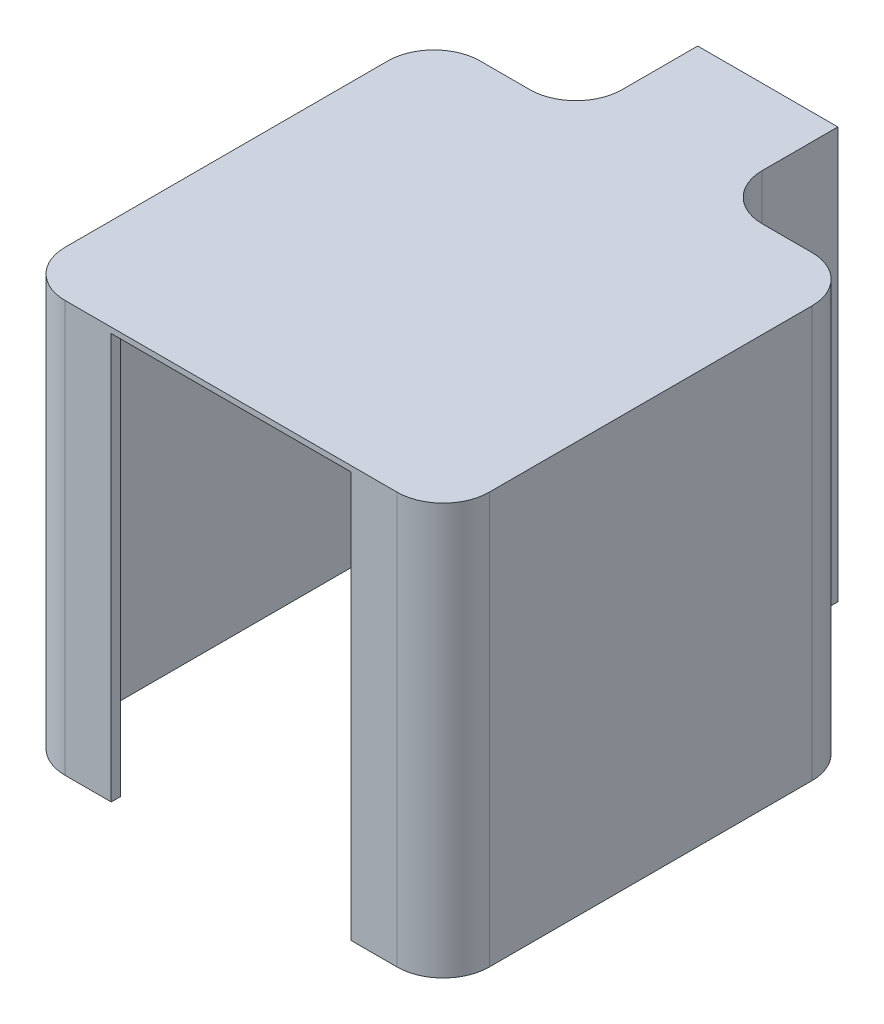
ISO-10303-21;
HEADER;
FILE_DESCRIPTION(('STEP AP214'),'2;1');
FILE_NAME('part.step','',(''),(''),'','','');
FILE_SCHEMA(('AUTOMOTIVE_DESIGN { 1 0 10303 214 1 1 1 1 }'));
ENDSEC;
DATA;
#1=APPLICATION_CONTEXT('core data for automotive mechanical design processes');
#2=APPLICATION_PROTOCOL_DEFINITION('international standard','automotive_design',2000,#1);
#3=PRODUCT_CONTEXT('',#1,'mechanical');
#4=PRODUCT('Part','Part','',(#3));
#5=PRODUCT_RELATED_PRODUCT_CATEGORY('part','',(#4));
#6=PRODUCT_DEFINITION_FORMATION('','',#4);
#7=PRODUCT_DEFINITION_CONTEXT('part definition',#1,'design');
#8=PRODUCT_DEFINITION('design','',#6,#7);
#9=PRODUCT_DEFINITION_SHAPE('','',#8);
#10=(LENGTH_UNIT() NAMED_UNIT(*) SI_UNIT(.MILLI.,.METRE.));
#11=(NAMED_UNIT(*) PLANE_ANGLE_UNIT() SI_UNIT($,.RADIAN.));
#12=(NAMED_UNIT(*) SI_UNIT($,.STERADIAN.) SOLID_ANGLE_UNIT());
#13=UNCERTAINTY_MEASURE_WITH_UNIT(LENGTH_MEASURE(1.E-05),#10,'distance_accuracy_value','');
#14=(GEOMETRIC_REPRESENTATION_CONTEXT(3) GLOBAL_UNCERTAINTY_ASSIGNED_CONTEXT((#13)) GLOBAL_UNIT_ASSIGNED_CONTEXT((#10,
#11,#12)) REPRESENTATION_CONTEXT('',''));
#15=CARTESIAN_POINT('',(0.,0.,0.));
#16=DIRECTION('',(0.,0.,1.));
#17=DIRECTION('',(1.,0.,0.));
#18=AXIS2_PLACEMENT_3D('',#15,#16,#17);
#19=CARTESIAN_POINT('',(65.,220.,107.5));
#20=DIRECTION('',(0.,0.,1.));
#21=DIRECTION('',(1.,0.,0.));
#22=AXIS2_PLACEMENT_3D('',#19,#20,#21);
#23=PLANE('',#22);
#24=DIRECTION('',(-1.,0.,0.));
#25=VECTOR('',#24,1.);
#26=CARTESIAN_POINT('',(65.,220.,107.5));
#27=LINE('',#26,#25);
#28=CARTESIAN_POINT('',(85.,220.,107.5));
#29=VERTEX_POINT('',#28);
#30=CARTESIAN_POINT('',(65.,220.,107.5));
#31=VERTEX_POINT('',#30);
#32=EDGE_CURVE('E300',#29,#31,#27,.T.);
#33=ORIENTED_EDGE('',*,*,#32,.F.);
#34=DIRECTION('',(0.,-1.,0.));
#35=VECTOR('',#34,1.);
#36=CARTESIAN_POINT('',(85.,0.,107.5));
#37=LINE('',#36,#35);
#38=CARTESIAN_POINT('',(85.,0.,107.5));
#39=VERTEX_POINT('',#38);
#40=EDGE_CURVE('E450',#29,#39,#37,.T.);
#41=ORIENTED_EDGE('',*,*,#40,.T.);
#42=DIRECTION('',(-1.,0.,0.));
#43=VECTOR('',#42,1.);
#44=CARTESIAN_POINT('',(65.,0.,107.5));
#45=LINE('',#44,#43);
#46=CARTESIAN_POINT('',(65.,0.,107.5));
#47=VERTEX_POINT('',#46);
#48=EDGE_CURVE('E295',#39,#47,#45,.T.);
#49=ORIENTED_EDGE('',*,*,#48,.T.);
#50=DIRECTION('',(0.,-1.,0.));
#51=VECTOR('',#50,1.);
#52=CARTESIAN_POINT('',(65.,220.,107.5));
#53=LINE('',#52,#51);
#54=EDGE_CURVE('E399',#31,#47,#53,.T.);
#55=ORIENTED_EDGE('',*,*,#54,.F.);
#56=EDGE_LOOP('',(#33,#41,#49,#55));
#57=FACE_BOUND('',#56,.T.);
#58=ADVANCED_FACE('F40',(#57),#23,.F.);
#59=CARTESIAN_POINT('',(65.,220.,107.5));
#60=DIRECTION('',(1.,0.,0.));
#61=DIRECTION('',(0.,0.,-1.));
#62=AXIS2_PLACEMENT_3D('',#59,#60,#61);
#63=PLANE('',#62);
#64=DIRECTION('',(0.,0.,1.));
#65=VECTOR('',#64,1.);
#66=CARTESIAN_POINT('',(65.,0.,107.5));
#67=LINE('',#66,#65);
#68=CARTESIAN_POINT('',(65.,0.,112.5));
#69=VERTEX_POINT('',#68);
#70=EDGE_CURVE('E334',#47,#69,#67,.T.);
#71=ORIENTED_EDGE('',*,*,#70,.T.);
#72=DIRECTION('',(0.,-1.,0.));
#73=VECTOR('',#72,1.);
#74=CARTESIAN_POINT('',(65.,220.,112.5));
#75=LINE('',#74,#73);
#76=CARTESIAN_POINT('',(65.,220.,112.5));
#77=VERTEX_POINT('',#76);
#78=EDGE_CURVE('E396',#77,#69,#75,.T.);
#79=ORIENTED_EDGE('',*,*,#78,.F.);
#80=DIRECTION('',(0.,0.,1.));
#81=VECTOR('',#80,1.);
#82=CARTESIAN_POINT('',(65.,220.,107.5));
#83=LINE('',#82,#81);
#84=EDGE_CURVE('E302',#31,#77,#83,.T.);
#85=ORIENTED_EDGE('',*,*,#84,.F.);
#86=ORIENTED_EDGE('',*,*,#54,.T.);
#87=EDGE_LOOP('',(#71,#79,#85,#86));
#88=FACE_BOUND('',#87,.T.);
#89=ADVANCED_FACE('F551',(#88),#63,.F.);
#90=CARTESIAN_POINT('',(115.,220.,-112.5));
#91=DIRECTION('',(-1.,0.,0.));
#92=DIRECTION('',(0.,0.,1.));
#93=AXIS2_PLACEMENT_3D('',#90,#91,#92);
#94=PLANE('',#93);
#95=DIRECTION('',(0.,0.,-1.));
#96=VECTOR('',#95,1.);
#97=CARTESIAN_POINT('',(115.,223.,112.5));
#98=LINE('',#97,#96);
#99=CARTESIAN_POINT('',(115.,223.,87.5));
#100=VERTEX_POINT('',#99);
#101=CARTESIAN_POINT('',(115.,223.,-87.5));
#102=VERTEX_POINT('',#101);
#103=EDGE_CURVE('E264',#100,#102,#98,.T.);
#104=ORIENTED_EDGE('',*,*,#103,.F.);
#105=DIRECTION('',(0.,-1.,0.));
#106=VECTOR('',#105,1.);
#107=CARTESIAN_POINT('',(115.,220.,87.5));
#108=LINE('',#107,#106);
#109=CARTESIAN_POINT('',(115.,0.,87.5));
#110=VERTEX_POINT('',#109);
#111=EDGE_CURVE('E435',#100,#110,#108,.T.);
#112=ORIENTED_EDGE('',*,*,#111,.T.);
#113=DIRECTION('',(0.,0.,-1.));
#114=VECTOR('',#113,1.);
#115=CARTESIAN_POINT('',(115.,0.,-112.5));
#116=LINE('',#115,#114);
#117=CARTESIAN_POINT('',(115.,0.,-87.5));
#118=VERTEX_POINT('',#117);
#119=EDGE_CURVE('E339',#110,#118,#116,.T.);
#120=ORIENTED_EDGE('',*,*,#119,.T.);
#121=DIRECTION('',(0.,-1.,0.));
#122=VECTOR('',#121,1.);
#123=CARTESIAN_POINT('',(115.,220.,-87.5));
#124=LINE('',#123,#122);
#125=EDGE_CURVE('E433',#118,#102,#124,.F.);
#126=ORIENTED_EDGE('',*,*,#125,.T.);
#127=EDGE_LOOP('',(#104,#112,#120,#126));
#128=FACE_BOUND('',#127,.T.);
#129=ADVANCED_FACE('F557',(#128),#94,.F.);
#130=CARTESIAN_POINT('',(38.,220.,-112.5));
#131=DIRECTION('',(0.,0.,1.));
#132=DIRECTION('',(1.,0.,0.));
#133=AXIS2_PLACEMENT_3D('',#130,#131,#132);
#134=PLANE('',#133);
#135=DIRECTION('',(-1.,0.,0.));
#136=VECTOR('',#135,1.);
#137=CARTESIAN_POINT('',(115.,223.,-112.5));
#138=LINE('',#137,#136);
#139=CARTESIAN_POINT('',(90.,223.,-112.5));
#140=VERTEX_POINT('',#139);
#141=CARTESIAN_POINT('',(63.,223.,-112.5));
#142=VERTEX_POINT('',#141);
#143=EDGE_CURVE('E250',#140,#142,#138,.T.);
#144=ORIENTED_EDGE('',*,*,#143,.F.);
#145=DIRECTION('',(0.,-1.,0.));
#146=VECTOR('',#145,1.);
#147=CARTESIAN_POINT('',(90.,220.,-112.5));
#148=LINE('',#147,#146);
#149=CARTESIAN_POINT('',(90.,0.,-112.5));
#150=VERTEX_POINT('',#149);
#151=EDGE_CURVE('E478',#140,#150,#148,.T.);
#152=ORIENTED_EDGE('',*,*,#151,.T.);
#153=DIRECTION('',(-1.,0.,0.));
#154=VECTOR('',#153,1.);
#155=CARTESIAN_POINT('',(38.,0.,-112.5));
#156=LINE('',#155,#154);
#157=CARTESIAN_POINT('',(63.,0.,-112.5));
#158=VERTEX_POINT('',#157);
#159=EDGE_CURVE('E270',#150,#158,#156,.T.);
#160=ORIENTED_EDGE('',*,*,#159,.T.);
#161=DIRECTION('',(0.,-1.,0.));
#162=VECTOR('',#161,1.);
#163=CARTESIAN_POINT('',(63.,220.,-112.5));
#164=LINE('',#163,#162);
#165=EDGE_CURVE('E267',#158,#142,#164,.F.);
#166=ORIENTED_EDGE('',*,*,#165,.T.);
#167=EDGE_LOOP('',(#144,#152,#160,#166));
#168=FACE_BOUND('',#167,.T.);
#169=ADVANCED_FACE('F268',(#168),#134,.F.);
#170=CARTESIAN_POINT('',(38.,220.,-112.5));
#171=DIRECTION('',(-1.,0.,0.));
#172=DIRECTION('',(0.,0.,1.));
#173=AXIS2_PLACEMENT_3D('',#170,#171,#172);
#174=PLANE('',#173);
#175=DIRECTION('',(0.,-1.,0.));
#176=VECTOR('',#175,1.);
#177=CARTESIAN_POINT('',(38.,220.,-178.5));
#178=LINE('',#177,#176);
#179=CARTESIAN_POINT('',(38.,223.,-178.5));
#180=VERTEX_POINT('',#179);
#181=CARTESIAN_POINT('',(38.,0.,-178.5));
#182=VERTEX_POINT('',#181);
#183=EDGE_CURVE('E393',#180,#182,#178,.T.);
#184=ORIENTED_EDGE('',*,*,#183,.F.);
#185=DIRECTION('',(0.,0.,-1.));
#186=VECTOR('',#185,1.);
#187=CARTESIAN_POINT('',(38.,223.,-137.5));
#188=LINE('',#187,#186);
#189=CARTESIAN_POINT('',(38.,223.,-137.5));
#190=VERTEX_POINT('',#189);
#191=EDGE_CURVE('E278',#190,#180,#188,.T.);
#192=ORIENTED_EDGE('',*,*,#191,.F.);
#193=DIRECTION('',(0.,-1.,0.));
#194=VECTOR('',#193,1.);
#195=CARTESIAN_POINT('',(38.,0.,-137.5));
#196=LINE('',#195,#194);
#197=CARTESIAN_POINT('',(38.,0.,-137.5));
#198=VERTEX_POINT('',#197);
#199=EDGE_CURVE('E274',#190,#198,#196,.T.);
#200=ORIENTED_EDGE('',*,*,#199,.T.);
#201=DIRECTION('',(0.,0.,-1.));
#202=VECTOR('',#201,1.);
#203=CARTESIAN_POINT('',(38.,0.,-112.5));
#204=LINE('',#203,#202);
#205=EDGE_CURVE('E343',#198,#182,#204,.T.);
#206=ORIENTED_EDGE('',*,*,#205,.T.);
#207=EDGE_LOOP('',(#184,#192,#200,#206));
#208=FACE_BOUND('',#207,.T.);
#209=ADVANCED_FACE('F526',(#208),#174,.F.);
#210=CARTESIAN_POINT('',(-38.,220.,-178.5));
#211=DIRECTION('',(0.,0.,1.));
#212=DIRECTION('',(1.,0.,0.));
#213=AXIS2_PLACEMENT_3D('',#210,#211,#212);
#214=PLANE('',#213);
#215=DIRECTION('',(-1.,0.,0.));
#216=VECTOR('',#215,1.);
#217=CARTESIAN_POINT('',(-38.,0.,-178.5));
#218=LINE('',#217,#216);
#219=CARTESIAN_POINT('',(-38.,0.,-178.5));
#220=VERTEX_POINT('',#219);
#221=EDGE_CURVE('E345',#182,#220,#218,.T.);
#222=ORIENTED_EDGE('',*,*,#221,.T.);
#223=DIRECTION('',(0.,-1.,0.));
#224=VECTOR('',#223,1.);
#225=CARTESIAN_POINT('',(-38.,220.,-178.5));
#226=LINE('',#225,#224);
#227=CARTESIAN_POINT('',(-38.,223.,-178.5));
#228=VERTEX_POINT('',#227);
#229=EDGE_CURVE('E390',#228,#220,#226,.T.);
#230=ORIENTED_EDGE('',*,*,#229,.F.);
#231=DIRECTION('',(-1.,0.,0.));
#232=VECTOR('',#231,1.);
#233=CARTESIAN_POINT('',(38.,223.,-178.5));
#234=LINE('',#233,#232);
#235=EDGE_CURVE('E280',#180,#228,#234,.T.);
#236=ORIENTED_EDGE('',*,*,#235,.F.);
#237=ORIENTED_EDGE('',*,*,#183,.T.);
#238=EDGE_LOOP('',(#222,#230,#236,#237));
#239=FACE_BOUND('',#238,.T.);
#240=ADVANCED_FACE('F530',(#239),#214,.F.);
#241=CARTESIAN_POINT('',(-38.,220.,-112.5));
#242=DIRECTION('',(1.,0.,0.));
#243=DIRECTION('',(0.,0.,-1.));
#244=AXIS2_PLACEMENT_3D('',#241,#242,#243);
#245=PLANE('',#244);
#246=DIRECTION('',(0.,0.,1.));
#247=VECTOR('',#246,1.);
#248=CARTESIAN_POINT('',(-38.,0.,-112.5));
#249=LINE('',#248,#247);
#250=CARTESIAN_POINT('',(-38.,0.,-137.5));
#251=VERTEX_POINT('',#250);
#252=EDGE_CURVE('E347',#220,#251,#249,.T.);
#253=ORIENTED_EDGE('',*,*,#252,.T.);
#254=DIRECTION('',(0.,-1.,0.));
#255=VECTOR('',#254,1.);
#256=CARTESIAN_POINT('',(-38.,220.,-137.5));
#257=LINE('',#256,#255);
#258=CARTESIAN_POINT('',(-38.,223.,-137.5));
#259=VERTEX_POINT('',#258);
#260=EDGE_CURVE('E416',#251,#259,#257,.F.);
#261=ORIENTED_EDGE('',*,*,#260,.T.);
#262=DIRECTION('',(0.,0.,1.));
#263=VECTOR('',#262,1.);
#264=CARTESIAN_POINT('',(-38.,223.,-178.5));
#265=LINE('',#264,#263);
#266=EDGE_CURVE('E286',#228,#259,#265,.T.);
#267=ORIENTED_EDGE('',*,*,#266,.F.);
#268=ORIENTED_EDGE('',*,*,#229,.T.);
#269=EDGE_LOOP('',(#253,#261,#267,#268));
#270=FACE_BOUND('',#269,.T.);
#271=ADVANCED_FACE('F533',(#270),#245,.F.);
#272=CARTESIAN_POINT('',(-115.,220.,-112.5));
#273=DIRECTION('',(0.,0.,1.));
#274=DIRECTION('',(1.,0.,0.));
#275=AXIS2_PLACEMENT_3D('',#272,#273,#274);
#276=PLANE('',#275);
#277=DIRECTION('',(-1.,0.,0.));
#278=VECTOR('',#277,1.);
#279=CARTESIAN_POINT('',(-115.,0.,-112.5));
#280=LINE('',#279,#278);
#281=CARTESIAN_POINT('',(-63.,0.,-112.5));
#282=VERTEX_POINT('',#281);
#283=CARTESIAN_POINT('',(-90.,0.,-112.5));
#284=VERTEX_POINT('',#283);
#285=EDGE_CURVE('E350',#282,#284,#280,.T.);
#286=ORIENTED_EDGE('',*,*,#285,.T.);
#287=DIRECTION('',(0.,-1.,0.));
#288=VECTOR('',#287,1.);
#289=CARTESIAN_POINT('',(-90.,220.,-112.5));
#290=LINE('',#289,#288);
#291=CARTESIAN_POINT('',(-90.,223.,-112.5));
#292=VERTEX_POINT('',#291);
#293=EDGE_CURVE('E484',#284,#292,#290,.F.);
#294=ORIENTED_EDGE('',*,*,#293,.T.);
#295=DIRECTION('',(-1.,0.,0.));
#296=VECTOR('',#295,1.);
#297=CARTESIAN_POINT('',(-63.,223.,-112.5));
#298=LINE('',#297,#296);
#299=CARTESIAN_POINT('',(-63.,223.,-112.5));
#300=VERTEX_POINT('',#299);
#301=EDGE_CURVE('E292',#300,#292,#298,.T.);
#302=ORIENTED_EDGE('',*,*,#301,.F.);
#303=DIRECTION('',(0.,-1.,0.));
#304=VECTOR('',#303,1.);
#305=CARTESIAN_POINT('',(-63.,0.,-112.5));
#306=LINE('',#305,#304);
#307=EDGE_CURVE('E413',#300,#282,#306,.T.);
#308=ORIENTED_EDGE('',*,*,#307,.T.);
#309=EDGE_LOOP('',(#286,#294,#302,#308));
#310=FACE_BOUND('',#309,.T.);
#311=ADVANCED_FACE('F540',(#310),#276,.F.);
#312=CARTESIAN_POINT('',(-115.,220.,-112.5));
#313=DIRECTION('',(1.,0.,0.));
#314=DIRECTION('',(0.,0.,-1.));
#315=AXIS2_PLACEMENT_3D('',#312,#313,#314);
#316=PLANE('',#315);
#317=DIRECTION('',(0.,0.,1.));
#318=VECTOR('',#317,1.);
#319=CARTESIAN_POINT('',(-115.,0.,-112.5));
#320=LINE('',#319,#318);
#321=CARTESIAN_POINT('',(-115.,0.,-87.5));
#322=VERTEX_POINT('',#321);
#323=CARTESIAN_POINT('',(-115.,0.,87.5));
#324=VERTEX_POINT('',#323);
#325=EDGE_CURVE('E352',#322,#324,#320,.T.);
#326=ORIENTED_EDGE('',*,*,#325,.T.);
#327=DIRECTION('',(0.,-1.,0.));
#328=VECTOR('',#327,1.);
#329=CARTESIAN_POINT('',(-115.,220.,87.5));
#330=LINE('',#329,#328);
#331=CARTESIAN_POINT('',(-115.,223.,87.5));
#332=VERTEX_POINT('',#331);
#333=EDGE_CURVE('E469',#324,#332,#330,.F.);
#334=ORIENTED_EDGE('',*,*,#333,.T.);
#335=DIRECTION('',(0.,0.,1.));
#336=VECTOR('',#335,1.);
#337=CARTESIAN_POINT('',(-115.,223.,-112.5));
#338=LINE('',#337,#336);
#339=CARTESIAN_POINT('',(-115.,223.,-87.5));
#340=VERTEX_POINT('',#339);
#341=EDGE_CURVE('E299',#340,#332,#338,.T.);
#342=ORIENTED_EDGE('',*,*,#341,.F.);
#343=DIRECTION('',(0.,-1.,0.));
#344=VECTOR('',#343,1.);
#345=CARTESIAN_POINT('',(-115.,220.,-87.5));
#346=LINE('',#345,#344);
#347=EDGE_CURVE('E466',#340,#322,#346,.T.);
#348=ORIENTED_EDGE('',*,*,#347,.T.);
#349=EDGE_LOOP('',(#326,#334,#342,#348));
#350=FACE_BOUND('',#349,.T.);
#351=ADVANCED_FACE('F503',(#350),#316,.F.);
#352=CARTESIAN_POINT('',(-115.,220.,112.5));
#353=DIRECTION('',(0.,0.,-1.));
#354=DIRECTION('',(-1.,0.,0.));
#355=AXIS2_PLACEMENT_3D('',#352,#353,#354);
#356=PLANE('',#355);
#357=DIRECTION('',(1.,0.,0.));
#358=VECTOR('',#357,1.);
#359=CARTESIAN_POINT('',(65.,0.,112.5));
#360=LINE('',#359,#358);
#361=CARTESIAN_POINT('',(90.,0.,112.5));
#362=VERTEX_POINT('',#361);
#363=EDGE_CURVE('E336',#69,#362,#360,.T.);
#364=ORIENTED_EDGE('',*,*,#363,.T.);
#365=DIRECTION('',(0.,-1.,0.));
#366=VECTOR('',#365,1.);
#367=CARTESIAN_POINT('',(90.,220.,112.5));
#368=LINE('',#367,#366);
#369=CARTESIAN_POINT('',(90.,223.,112.5));
#370=VERTEX_POINT('',#369);
#371=EDGE_CURVE('E441',#362,#370,#368,.F.);
#372=ORIENTED_EDGE('',*,*,#371,.T.);
#373=DIRECTION('',(1.,0.,0.));
#374=VECTOR('',#373,1.);
#375=CARTESIAN_POINT('',(-115.,223.,112.5));
#376=LINE('',#375,#374);
#377=CARTESIAN_POINT('',(-90.,223.,112.5));
#378=VERTEX_POINT('',#377);
#379=EDGE_CURVE('E510',#378,#370,#376,.T.);
#380=ORIENTED_EDGE('',*,*,#379,.F.);
#381=DIRECTION('',(0.,-1.,0.));
#382=VECTOR('',#381,1.);
#383=CARTESIAN_POINT('',(-90.,220.,112.5));
#384=LINE('',#383,#382);
#385=CARTESIAN_POINT('',(-90.,0.,112.5));
#386=VERTEX_POINT('',#385);
#387=EDGE_CURVE('E438',#378,#386,#384,.T.);
#388=ORIENTED_EDGE('',*,*,#387,.T.);
#389=DIRECTION('',(1.,0.,0.));
#390=VECTOR('',#389,1.);
#391=CARTESIAN_POINT('',(-115.,0.,112.5));
#392=LINE('',#391,#390);
#393=CARTESIAN_POINT('',(-65.,0.,112.5));
#394=VERTEX_POINT('',#393);
#395=EDGE_CURVE('E355',#386,#394,#392,.T.);
#396=ORIENTED_EDGE('',*,*,#395,.T.);
#397=DIRECTION('',(0.,-1.,0.));
#398=VECTOR('',#397,1.);
#399=CARTESIAN_POINT('',(-65.,220.,112.5));
#400=LINE('',#399,#398);
#401=CARTESIAN_POINT('',(-65.,220.,112.5));
#402=VERTEX_POINT('',#401);
#403=EDGE_CURVE('E387',#402,#394,#400,.T.);
#404=ORIENTED_EDGE('',*,*,#403,.F.);
#405=DIRECTION('',(1.,0.,0.));
#406=VECTOR('',#405,1.);
#407=CARTESIAN_POINT('',(-115.,220.,112.5));
#408=LINE('',#407,#406);
#409=EDGE_CURVE('E296',#402,#77,#408,.T.);
#410=ORIENTED_EDGE('',*,*,#409,.T.);
#411=ORIENTED_EDGE('',*,*,#78,.T.);
#412=EDGE_LOOP('',(#364,#372,#380,#388,#396,#404,#410,#411));
#413=FACE_BOUND('',#412,.T.);
#414=ADVANCED_FACE('F513',(#413),#356,.F.);
#415=CARTESIAN_POINT('',(-65.,220.,107.5));
#416=DIRECTION('',(-1.,0.,0.));
#417=DIRECTION('',(0.,0.,1.));
#418=AXIS2_PLACEMENT_3D('',#415,#416,#417);
#419=PLANE('',#418);
#420=DIRECTION('',(0.,0.,-1.));
#421=VECTOR('',#420,1.);
#422=CARTESIAN_POINT('',(-65.,0.,107.5));
#423=LINE('',#422,#421);
#424=CARTESIAN_POINT('',(-65.,0.,107.5));
#425=VERTEX_POINT('',#424);
#426=EDGE_CURVE('E357',#394,#425,#423,.T.);
#427=ORIENTED_EDGE('',*,*,#426,.T.);
#428=DIRECTION('',(0.,-1.,0.));
#429=VECTOR('',#428,1.);
#430=CARTESIAN_POINT('',(-65.,220.,107.5));
#431=LINE('',#430,#429);
#432=CARTESIAN_POINT('',(-65.,220.,107.5));
#433=VERTEX_POINT('',#432);
#434=EDGE_CURVE('E384',#433,#425,#431,.T.);
#435=ORIENTED_EDGE('',*,*,#434,.F.);
#436=DIRECTION('',(0.,0.,-1.));
#437=VECTOR('',#436,1.);
#438=CARTESIAN_POINT('',(-65.,220.,107.5));
#439=LINE('',#438,#437);
#440=EDGE_CURVE('E306',#402,#433,#439,.T.);
#441=ORIENTED_EDGE('',*,*,#440,.F.);
#442=ORIENTED_EDGE('',*,*,#403,.T.);
#443=EDGE_LOOP('',(#427,#435,#441,#442));
#444=FACE_BOUND('',#443,.T.);
#445=ADVANCED_FACE('F615',(#444),#419,.F.);
#446=CARTESIAN_POINT('',(-110.,220.,107.5));
#447=DIRECTION('',(0.,0.,1.));
#448=DIRECTION('',(1.,0.,0.));
#449=AXIS2_PLACEMENT_3D('',#446,#447,#448);
#450=PLANE('',#449);
#451=DIRECTION('',(-1.,0.,0.));
#452=VECTOR('',#451,1.);
#453=CARTESIAN_POINT('',(-110.,0.,107.5));
#454=LINE('',#453,#452);
#455=CARTESIAN_POINT('',(-85.,0.,107.5));
#456=VERTEX_POINT('',#455);
#457=EDGE_CURVE('E359',#425,#456,#454,.T.);
#458=ORIENTED_EDGE('',*,*,#457,.T.);
#459=DIRECTION('',(0.,-1.,0.));
#460=VECTOR('',#459,1.);
#461=CARTESIAN_POINT('',(-85.,220.,107.5));
#462=LINE('',#461,#460);
#463=CARTESIAN_POINT('',(-85.,220.,107.5));
#464=VERTEX_POINT('',#463);
#465=EDGE_CURVE('E476',#456,#464,#462,.F.);
#466=ORIENTED_EDGE('',*,*,#465,.T.);
#467=DIRECTION('',(-1.,0.,0.));
#468=VECTOR('',#467,1.);
#469=CARTESIAN_POINT('',(-110.,220.,107.5));
#470=LINE('',#469,#468);
#471=EDGE_CURVE('E309',#433,#464,#470,.T.);
#472=ORIENTED_EDGE('',*,*,#471,.F.);
#473=ORIENTED_EDGE('',*,*,#434,.T.);
#474=EDGE_LOOP('',(#458,#466,#472,#473));
#475=FACE_BOUND('',#474,.T.);
#476=ADVANCED_FACE('F671',(#475),#450,.F.);
#477=CARTESIAN_POINT('',(-110.,220.,-107.5));
#478=DIRECTION('',(-1.,0.,0.));
#479=DIRECTION('',(0.,0.,1.));
#480=AXIS2_PLACEMENT_3D('',#477,#478,#479);
#481=PLANE('',#480);
#482=DIRECTION('',(0.,0.,-1.));
#483=VECTOR('',#482,1.);
#484=CARTESIAN_POINT('',(-110.,220.,-107.5));
#485=LINE('',#484,#483);
#486=CARTESIAN_POINT('',(-110.,220.,82.5));
#487=VERTEX_POINT('',#486);
#488=CARTESIAN_POINT('',(-110.,220.,-82.5));
#489=VERTEX_POINT('',#488);
#490=EDGE_CURVE('E312',#487,#489,#485,.T.);
#491=ORIENTED_EDGE('',*,*,#490,.F.);
#492=DIRECTION('',(0.,-1.,0.));
#493=VECTOR('',#492,1.);
#494=CARTESIAN_POINT('',(-110.,0.,82.5));
#495=LINE('',#494,#493);
#496=CARTESIAN_POINT('',(-110.,0.,82.5));
#497=VERTEX_POINT('',#496);
#498=EDGE_CURVE('E473',#487,#497,#495,.T.);
#499=ORIENTED_EDGE('',*,*,#498,.T.);
#500=DIRECTION('',(0.,0.,-1.));
#501=VECTOR('',#500,1.);
#502=CARTESIAN_POINT('',(-110.,0.,-107.5));
#503=LINE('',#502,#501);
#504=CARTESIAN_POINT('',(-110.,0.,-82.5));
#505=VERTEX_POINT('',#504);
#506=EDGE_CURVE('E362',#497,#505,#503,.T.);
#507=ORIENTED_EDGE('',*,*,#506,.T.);
#508=DIRECTION('',(0.,-1.,0.));
#509=VECTOR('',#508,1.);
#510=CARTESIAN_POINT('',(-110.,220.,-82.5));
#511=LINE('',#510,#509);
#512=EDGE_CURVE('E471',#505,#489,#511,.F.);
#513=ORIENTED_EDGE('',*,*,#512,.T.);
#514=EDGE_LOOP('',(#491,#499,#507,#513));
#515=FACE_BOUND('',#514,.T.);
#516=ADVANCED_FACE('F624',(#515),#481,.F.);
#517=CARTESIAN_POINT('',(-110.,220.,-107.5));
#518=DIRECTION('',(0.,0.,-1.));
#519=DIRECTION('',(-1.,0.,0.));
#520=AXIS2_PLACEMENT_3D('',#517,#518,#519);
#521=PLANE('',#520);
#522=DIRECTION('',(1.,0.,0.));
#523=VECTOR('',#522,1.);
#524=CARTESIAN_POINT('',(-110.,220.,-107.5));
#525=LINE('',#524,#523);
#526=CARTESIAN_POINT('',(-85.,220.,-107.5));
#527=VERTEX_POINT('',#526);
#528=CARTESIAN_POINT('',(-58.,220.,-107.5));
#529=VERTEX_POINT('',#528);
#530=EDGE_CURVE('E315',#527,#529,#525,.T.);
#531=ORIENTED_EDGE('',*,*,#530,.F.);
#532=DIRECTION('',(0.,-1.,0.));
#533=VECTOR('',#532,1.);
#534=CARTESIAN_POINT('',(-85.,0.,-107.5));
#535=LINE('',#534,#533);
#536=CARTESIAN_POINT('',(-85.,0.,-107.5));
#537=VERTEX_POINT('',#536);
#538=EDGE_CURVE('E482',#527,#537,#535,.T.);
#539=ORIENTED_EDGE('',*,*,#538,.T.);
#540=DIRECTION('',(1.,0.,0.));
#541=VECTOR('',#540,1.);
#542=CARTESIAN_POINT('',(-110.,0.,-107.5));
#543=LINE('',#542,#541);
#544=CARTESIAN_POINT('',(-58.,0.,-107.5));
#545=VERTEX_POINT('',#544);
#546=EDGE_CURVE('E365',#537,#545,#543,.T.);
#547=ORIENTED_EDGE('',*,*,#546,.T.);
#548=DIRECTION('',(0.,-1.,0.));
#549=VECTOR('',#548,1.);
#550=CARTESIAN_POINT('',(-58.,220.,-107.5));
#551=LINE('',#550,#549);
#552=EDGE_CURVE('E410',#545,#529,#551,.F.);
#553=ORIENTED_EDGE('',*,*,#552,.T.);
#554=EDGE_LOOP('',(#531,#539,#547,#553));
#555=FACE_BOUND('',#554,.T.);
#556=ADVANCED_FACE('F631',(#555),#521,.F.);
#557=CARTESIAN_POINT('',(-33.,220.,-107.5));
#558=DIRECTION('',(-1.,0.,0.));
#559=DIRECTION('',(0.,0.,1.));
#560=AXIS2_PLACEMENT_3D('',#557,#558,#559);
#561=PLANE('',#560);
#562=DIRECTION('',(0.,0.,-1.));
#563=VECTOR('',#562,1.);
#564=CARTESIAN_POINT('',(-33.,220.,-107.5));
#565=LINE('',#564,#563);
#566=CARTESIAN_POINT('',(-33.,220.,-132.5));
#567=VERTEX_POINT('',#566);
#568=CARTESIAN_POINT('',(-33.,220.,-173.5));
#569=VERTEX_POINT('',#568);
#570=EDGE_CURVE('E317',#567,#569,#565,.T.);
#571=ORIENTED_EDGE('',*,*,#570,.F.);
#572=DIRECTION('',(0.,-1.,0.));
#573=VECTOR('',#572,1.);
#574=CARTESIAN_POINT('',(-33.,220.,-132.5));
#575=LINE('',#574,#573);
#576=CARTESIAN_POINT('',(-33.,0.,-132.5));
#577=VERTEX_POINT('',#576);
#578=EDGE_CURVE('E273',#567,#577,#575,.T.);
#579=ORIENTED_EDGE('',*,*,#578,.T.);
#580=DIRECTION('',(0.,0.,-1.));
#581=VECTOR('',#580,1.);
#582=CARTESIAN_POINT('',(-33.,0.,-107.5));
#583=LINE('',#582,#581);
#584=CARTESIAN_POINT('',(-33.,0.,-173.5));
#585=VERTEX_POINT('',#584);
#586=EDGE_CURVE('E367',#577,#585,#583,.T.);
#587=ORIENTED_EDGE('',*,*,#586,.T.);
#588=DIRECTION('',(0.,-1.,0.));
#589=VECTOR('',#588,1.);
#590=CARTESIAN_POINT('',(-33.,220.,-173.5));
#591=LINE('',#590,#589);
#592=EDGE_CURVE('E381',#569,#585,#591,.T.);
#593=ORIENTED_EDGE('',*,*,#592,.F.);
#594=EDGE_LOOP('',(#571,#579,#587,#593));
#595=FACE_BOUND('',#594,.T.);
#596=ADVANCED_FACE('F636',(#595),#561,.F.);
#597=CARTESIAN_POINT('',(-33.,220.,-173.5));
#598=DIRECTION('',(0.,0.,-1.));
#599=DIRECTION('',(-1.,0.,0.));
#600=AXIS2_PLACEMENT_3D('',#597,#598,#599);
#601=PLANE('',#600);
#602=DIRECTION('',(1.,0.,0.));
#603=VECTOR('',#602,1.);
#604=CARTESIAN_POINT('',(-33.,0.,-173.5));
#605=LINE('',#604,#603);
#606=CARTESIAN_POINT('',(33.,0.,-173.5));
#607=VERTEX_POINT('',#606);
#608=EDGE_CURVE('E369',#585,#607,#605,.T.);
#609=ORIENTED_EDGE('',*,*,#608,.T.);
#610=DIRECTION('',(0.,-1.,0.));
#611=VECTOR('',#610,1.);
#612=CARTESIAN_POINT('',(33.,220.,-173.5));
#613=LINE('',#612,#611);
#614=CARTESIAN_POINT('',(33.,220.,-173.5));
#615=VERTEX_POINT('',#614);
#616=EDGE_CURVE('E332',#615,#607,#613,.T.);
#617=ORIENTED_EDGE('',*,*,#616,.F.);
#618=DIRECTION('',(1.,0.,0.));
#619=VECTOR('',#618,1.);
#620=CARTESIAN_POINT('',(-33.,220.,-173.5));
#621=LINE('',#620,#619);
#622=EDGE_CURVE('E320',#569,#615,#621,.T.);
#623=ORIENTED_EDGE('',*,*,#622,.F.);
#624=ORIENTED_EDGE('',*,*,#592,.T.);
#625=EDGE_LOOP('',(#609,#617,#623,#624));
#626=FACE_BOUND('',#625,.T.);
#627=ADVANCED_FACE('F641',(#626),#601,.F.);
#628=CARTESIAN_POINT('',(33.,220.,-107.5));
#629=DIRECTION('',(1.,0.,0.));
#630=DIRECTION('',(0.,0.,-1.));
#631=AXIS2_PLACEMENT_3D('',#628,#629,#630);
#632=PLANE('',#631);
#633=DIRECTION('',(0.,0.,1.));
#634=VECTOR('',#633,1.);
#635=CARTESIAN_POINT('',(33.,0.,-107.5));
#636=LINE('',#635,#634);
#637=CARTESIAN_POINT('',(33.,0.,-132.5));
#638=VERTEX_POINT('',#637);
#639=EDGE_CURVE('E371',#607,#638,#636,.T.);
#640=ORIENTED_EDGE('',*,*,#639,.T.);
#641=DIRECTION('',(0.,-1.,0.));
#642=VECTOR('',#641,1.);
#643=CARTESIAN_POINT('',(33.,220.,-132.5));
#644=LINE('',#643,#642);
#645=CARTESIAN_POINT('',(33.,220.,-132.5));
#646=VERTEX_POINT('',#645);
#647=EDGE_CURVE('E405',#638,#646,#644,.F.);
#648=ORIENTED_EDGE('',*,*,#647,.T.);
#649=DIRECTION('',(0.,0.,1.));
#650=VECTOR('',#649,1.);
#651=CARTESIAN_POINT('',(33.,220.,-107.5));
#652=LINE('',#651,#650);
#653=EDGE_CURVE('E323',#615,#646,#652,.T.);
#654=ORIENTED_EDGE('',*,*,#653,.F.);
#655=ORIENTED_EDGE('',*,*,#616,.T.);
#656=EDGE_LOOP('',(#640,#648,#654,#655));
#657=FACE_BOUND('',#656,.T.);
#658=ADVANCED_FACE('F644',(#657),#632,.F.);
#659=CARTESIAN_POINT('',(33.,220.,-107.5));
#660=DIRECTION('',(0.,0.,-1.));
#661=DIRECTION('',(-1.,0.,0.));
#662=AXIS2_PLACEMENT_3D('',#659,#660,#661);
#663=PLANE('',#662);
#664=DIRECTION('',(1.,0.,0.));
#665=VECTOR('',#664,1.);
#666=CARTESIAN_POINT('',(33.,0.,-107.5));
#667=LINE('',#666,#665);
#668=CARTESIAN_POINT('',(58.,0.,-107.5));
#669=VERTEX_POINT('',#668);
#670=CARTESIAN_POINT('',(85.,0.,-107.5));
#671=VERTEX_POINT('',#670);
#672=EDGE_CURVE('E374',#669,#671,#667,.T.);
#673=ORIENTED_EDGE('',*,*,#672,.T.);
#674=DIRECTION('',(0.,-1.,0.));
#675=VECTOR('',#674,1.);
#676=CARTESIAN_POINT('',(85.,220.,-107.5));
#677=LINE('',#676,#675);
#678=CARTESIAN_POINT('',(85.,220.,-107.5));
#679=VERTEX_POINT('',#678);
#680=EDGE_CURVE('E480',#671,#679,#677,.F.);
#681=ORIENTED_EDGE('',*,*,#680,.T.);
#682=DIRECTION('',(1.,0.,0.));
#683=VECTOR('',#682,1.);
#684=CARTESIAN_POINT('',(33.,220.,-107.5));
#685=LINE('',#684,#683);
#686=CARTESIAN_POINT('',(58.,220.,-107.5));
#687=VERTEX_POINT('',#686);
#688=EDGE_CURVE('E326',#687,#679,#685,.T.);
#689=ORIENTED_EDGE('',*,*,#688,.F.);
#690=DIRECTION('',(0.,-1.,0.));
#691=VECTOR('',#690,1.);
#692=CARTESIAN_POINT('',(58.,220.,-107.5));
#693=LINE('',#692,#691);
#694=EDGE_CURVE('E402',#687,#669,#693,.T.);
#695=ORIENTED_EDGE('',*,*,#694,.T.);
#696=EDGE_LOOP('',(#673,#681,#689,#695));
#697=FACE_BOUND('',#696,.T.);
#698=ADVANCED_FACE('F650',(#697),#663,.F.);
#699=CARTESIAN_POINT('',(110.,220.,-107.5));
#700=DIRECTION('',(1.,0.,0.));
#701=DIRECTION('',(0.,0.,-1.));
#702=AXIS2_PLACEMENT_3D('',#699,#700,#701);
#703=PLANE('',#702);
#704=DIRECTION('',(0.,0.,1.));
#705=VECTOR('',#704,1.);
#706=CARTESIAN_POINT('',(110.,0.,-107.5));
#707=LINE('',#706,#705);
#708=CARTESIAN_POINT('',(110.,0.,-82.5));
#709=VERTEX_POINT('',#708);
#710=CARTESIAN_POINT('',(110.,0.,82.5));
#711=VERTEX_POINT('',#710);
#712=EDGE_CURVE('E303',#709,#711,#707,.T.);
#713=ORIENTED_EDGE('',*,*,#712,.T.);
#714=DIRECTION('',(0.,-1.,0.));
#715=VECTOR('',#714,1.);
#716=CARTESIAN_POINT('',(110.,220.,82.5));
#717=LINE('',#716,#715);
#718=CARTESIAN_POINT('',(110.,220.,82.5));
#719=VERTEX_POINT('',#718);
#720=EDGE_CURVE('E456',#711,#719,#717,.F.);
#721=ORIENTED_EDGE('',*,*,#720,.T.);
#722=DIRECTION('',(0.,0.,1.));
#723=VECTOR('',#722,1.);
#724=CARTESIAN_POINT('',(110.,220.,-107.5));
#725=LINE('',#724,#723);
#726=CARTESIAN_POINT('',(110.,220.,-82.5));
#727=VERTEX_POINT('',#726);
#728=EDGE_CURVE('E329',#727,#719,#725,.T.);
#729=ORIENTED_EDGE('',*,*,#728,.F.);
#730=DIRECTION('',(0.,-1.,0.));
#731=VECTOR('',#730,1.);
#732=CARTESIAN_POINT('',(110.,0.,-82.5));
#733=LINE('',#732,#731);
#734=EDGE_CURVE('E453',#727,#709,#733,.T.);
#735=ORIENTED_EDGE('',*,*,#734,.T.);
#736=EDGE_LOOP('',(#713,#721,#729,#735));
#737=FACE_BOUND('',#736,.T.);
#738=ADVANCED_FACE('F603',(#737),#703,.F.);
#739=CARTESIAN_POINT('',(0.,0.,0.));
#740=DIRECTION('',(0.,-1.,0.));
#741=DIRECTION('',(0.,0.,-1.));
#742=AXIS2_PLACEMENT_3D('',#739,#740,#741);
#743=PLANE('',#742);
#744=ORIENTED_EDGE('',*,*,#119,.F.);
#745=CARTESIAN_POINT('',(90.,0.,87.5));
#746=DIRECTION('',(0.,-1.,0.));
#747=DIRECTION('',(0.,0.,-1.));
#748=AXIS2_PLACEMENT_3D('',#745,#746,#747);
#749=CIRCLE('',#748,25.);
#750=EDGE_CURVE('E11',#110,#362,#749,.T.);
#751=ORIENTED_EDGE('',*,*,#750,.T.);
#752=ORIENTED_EDGE('',*,*,#363,.F.);
#753=ORIENTED_EDGE('',*,*,#70,.F.);
#754=ORIENTED_EDGE('',*,*,#48,.F.);
#755=CARTESIAN_POINT('',(85.,0.,82.5));
#756=DIRECTION('',(0.,-1.,0.));
#757=DIRECTION('',(0.,0.,-1.));
#758=AXIS2_PLACEMENT_3D('',#755,#756,#757);
#759=CIRCLE('',#758,25.);
#760=EDGE_CURVE('E486',#39,#711,#759,.F.);
#761=ORIENTED_EDGE('',*,*,#760,.T.);
#762=ORIENTED_EDGE('',*,*,#712,.F.);
#763=CARTESIAN_POINT('',(85.,0.,-82.5));
#764=DIRECTION('',(0.,-1.,0.));
#765=DIRECTION('',(0.,0.,-1.));
#766=AXIS2_PLACEMENT_3D('',#763,#764,#765);
#767=CIRCLE('',#766,25.);
#768=EDGE_CURVE('E490',#709,#671,#767,.F.);
#769=ORIENTED_EDGE('',*,*,#768,.T.);
#770=ORIENTED_EDGE('',*,*,#672,.F.);
#771=CARTESIAN_POINT('',(58.,0.,-132.5));
#772=DIRECTION('',(0.,-1.,0.));
#773=DIRECTION('',(0.,0.,-1.));
#774=AXIS2_PLACEMENT_3D('',#771,#772,#773);
#775=CIRCLE('',#774,25.);
#776=EDGE_CURVE('E425',#669,#638,#775,.T.);
#777=ORIENTED_EDGE('',*,*,#776,.T.);
#778=ORIENTED_EDGE('',*,*,#639,.F.);
#779=ORIENTED_EDGE('',*,*,#608,.F.);
#780=ORIENTED_EDGE('',*,*,#586,.F.);
#781=CARTESIAN_POINT('',(-58.,0.,-132.5));
#782=DIRECTION('',(0.,-1.,0.));
#783=DIRECTION('',(0.,0.,-1.));
#784=AXIS2_PLACEMENT_3D('',#781,#782,#783);
#785=CIRCLE('',#784,25.);
#786=EDGE_CURVE('E422',#577,#545,#785,.T.);
#787=ORIENTED_EDGE('',*,*,#786,.T.);
#788=ORIENTED_EDGE('',*,*,#546,.F.);
#789=CARTESIAN_POINT('',(-85.,0.,-82.5));
#790=DIRECTION('',(0.,-1.,0.));
#791=DIRECTION('',(0.,0.,-1.));
#792=AXIS2_PLACEMENT_3D('',#789,#790,#791);
#793=CIRCLE('',#792,25.);
#794=EDGE_CURVE('E63',#537,#505,#793,.F.);
#795=ORIENTED_EDGE('',*,*,#794,.T.);
#796=ORIENTED_EDGE('',*,*,#506,.F.);
#797=CARTESIAN_POINT('',(-85.,0.,82.5));
#798=DIRECTION('',(0.,-1.,0.));
#799=DIRECTION('',(0.,0.,-1.));
#800=AXIS2_PLACEMENT_3D('',#797,#798,#799);
#801=CIRCLE('',#800,25.);
#802=EDGE_CURVE('E488',#497,#456,#801,.F.);
#803=ORIENTED_EDGE('',*,*,#802,.T.);
#804=ORIENTED_EDGE('',*,*,#457,.F.);
#805=ORIENTED_EDGE('',*,*,#426,.F.);
#806=ORIENTED_EDGE('',*,*,#395,.F.);
#807=CARTESIAN_POINT('',(-90.,0.,87.5));
#808=DIRECTION('',(0.,-1.,0.));
#809=DIRECTION('',(0.,0.,-1.));
#810=AXIS2_PLACEMENT_3D('',#807,#808,#809);
#811=CIRCLE('',#810,25.);
#812=EDGE_CURVE('E48',#386,#324,#811,.T.);
#813=ORIENTED_EDGE('',*,*,#812,.T.);
#814=ORIENTED_EDGE('',*,*,#325,.F.);
#815=CARTESIAN_POINT('',(-90.,0.,-87.5));
#816=DIRECTION('',(0.,-1.,0.));
#817=DIRECTION('',(0.,0.,-1.));
#818=AXIS2_PLACEMENT_3D('',#815,#816,#817);
#819=CIRCLE('',#818,25.);
#820=EDGE_CURVE('E55',#322,#284,#819,.T.);
#821=ORIENTED_EDGE('',*,*,#820,.T.);
#822=ORIENTED_EDGE('',*,*,#285,.F.);
#823=CARTESIAN_POINT('',(-63.,0.,-137.5));
#824=DIRECTION('',(0.,-1.,0.));
#825=DIRECTION('',(0.,0.,-1.));
#826=AXIS2_PLACEMENT_3D('',#823,#824,#825);
#827=CIRCLE('',#826,25.);
#828=EDGE_CURVE('E420',#282,#251,#827,.F.);
#829=ORIENTED_EDGE('',*,*,#828,.T.);
#830=ORIENTED_EDGE('',*,*,#252,.F.);
#831=ORIENTED_EDGE('',*,*,#221,.F.);
#832=ORIENTED_EDGE('',*,*,#205,.F.);
#833=CARTESIAN_POINT('',(63.,0.,-137.5));
#834=DIRECTION('',(0.,-1.,0.));
#835=DIRECTION('',(0.,0.,-1.));
#836=AXIS2_PLACEMENT_3D('',#833,#834,#835);
#837=CIRCLE('',#836,25.);
#838=EDGE_CURVE('E418',#198,#158,#837,.F.);
#839=ORIENTED_EDGE('',*,*,#838,.T.);
#840=ORIENTED_EDGE('',*,*,#159,.F.);
#841=CARTESIAN_POINT('',(90.,0.,-87.5));
#842=DIRECTION('',(0.,-1.,0.));
#843=DIRECTION('',(0.,0.,-1.));
#844=AXIS2_PLACEMENT_3D('',#841,#842,#843);
#845=CIRCLE('',#844,25.);
#846=EDGE_CURVE('E494',#150,#118,#845,.T.);
#847=ORIENTED_EDGE('',*,*,#846,.T.);
#848=EDGE_LOOP('',(#744,#751,#752,#753,#754,#761,#762,#769,#770,#777,#778,#779,#780,#787,#788,
#795,#796,#803,#804,#805,#806,#813,#814,#821,#822,#829,#830,#831,#832,#839,#840,#847));
#849=FACE_BOUND('',#848,.T.);
#850=ADVANCED_FACE('F497',(#849),#743,.T.);
#851=CARTESIAN_POINT('',(58.,220.,-132.5));
#852=DIRECTION('',(0.,-1.,0.));
#853=DIRECTION('',(0.,0.,-1.));
#854=AXIS2_PLACEMENT_3D('',#851,#852,#853);
#855=CYLINDRICAL_SURFACE('',#854,25.);
#856=CARTESIAN_POINT('',(58.,220.,-132.5));
#857=DIRECTION('',(0.,-1.,0.));
#858=DIRECTION('',(0.,0.,-1.));
#859=AXIS2_PLACEMENT_3D('',#856,#857,#858);
#860=CIRCLE('',#859,25.);
#861=EDGE_CURVE('E430',#646,#687,#860,.F.);
#862=ORIENTED_EDGE('',*,*,#861,.F.);
#863=ORIENTED_EDGE('',*,*,#647,.F.);
#864=ORIENTED_EDGE('',*,*,#776,.F.);
#865=ORIENTED_EDGE('',*,*,#694,.F.);
#866=EDGE_LOOP('',(#862,#863,#864,#865));
#867=FACE_BOUND('',#866,.T.);
#868=ADVANCED_FACE('F563',(#867),#855,.T.);
#869=CARTESIAN_POINT('',(63.,220.,-137.5));
#870=DIRECTION('',(0.,1.,0.));
#871=DIRECTION('',(0.,0.,1.));
#872=AXIS2_PLACEMENT_3D('',#869,#870,#871);
#873=CYLINDRICAL_SURFACE('',#872,25.);
#874=ORIENTED_EDGE('',*,*,#199,.F.);
#875=CARTESIAN_POINT('',(63.,223.,-137.5));
#876=DIRECTION('',(0.,-1.,0.));
#877=DIRECTION('',(0.,0.,-1.));
#878=AXIS2_PLACEMENT_3D('',#875,#876,#877);
#879=CIRCLE('',#878,25.);
#880=EDGE_CURVE('E256',#142,#190,#879,.T.);
#881=ORIENTED_EDGE('',*,*,#880,.F.);
#882=ORIENTED_EDGE('',*,*,#165,.F.);
#883=ORIENTED_EDGE('',*,*,#838,.F.);
#884=EDGE_LOOP('',(#874,#881,#882,#883));
#885=FACE_BOUND('',#884,.T.);
#886=ADVANCED_FACE('F276',(#885),#873,.F.);
#887=CARTESIAN_POINT('',(-58.,220.,-132.5));
#888=DIRECTION('',(0.,-1.,0.));
#889=DIRECTION('',(0.,0.,-1.));
#890=AXIS2_PLACEMENT_3D('',#887,#888,#889);
#891=CYLINDRICAL_SURFACE('',#890,25.);
#892=CARTESIAN_POINT('',(-58.,220.,-132.5));
#893=DIRECTION('',(0.,-1.,0.));
#894=DIRECTION('',(0.,0.,-1.));
#895=AXIS2_PLACEMENT_3D('',#892,#893,#894);
#896=CIRCLE('',#895,25.);
#897=EDGE_CURVE('E427',#529,#567,#896,.F.);
#898=ORIENTED_EDGE('',*,*,#897,.F.);
#899=ORIENTED_EDGE('',*,*,#552,.F.);
#900=ORIENTED_EDGE('',*,*,#786,.F.);
#901=ORIENTED_EDGE('',*,*,#578,.F.);
#902=EDGE_LOOP('',(#898,#899,#900,#901));
#903=FACE_BOUND('',#902,.T.);
#904=ADVANCED_FACE('F569',(#903),#891,.T.);
#905=CARTESIAN_POINT('',(-63.,220.,-137.5));
#906=DIRECTION('',(0.,1.,0.));
#907=DIRECTION('',(0.,0.,1.));
#908=AXIS2_PLACEMENT_3D('',#905,#906,#907);
#909=CYLINDRICAL_SURFACE('',#908,25.);
#910=ORIENTED_EDGE('',*,*,#307,.F.);
#911=CARTESIAN_POINT('',(-63.,223.,-137.5));
#912=DIRECTION('',(0.,-1.,0.));
#913=DIRECTION('',(0.,0.,-1.));
#914=AXIS2_PLACEMENT_3D('',#911,#912,#913);
#915=CIRCLE('',#914,25.);
#916=EDGE_CURVE('E289',#259,#300,#915,.T.);
#917=ORIENTED_EDGE('',*,*,#916,.F.);
#918=ORIENTED_EDGE('',*,*,#260,.F.);
#919=ORIENTED_EDGE('',*,*,#828,.F.);
#920=EDGE_LOOP('',(#910,#917,#918,#919));
#921=FACE_BOUND('',#920,.T.);
#922=ADVANCED_FACE('F536',(#921),#909,.F.);
#923=CARTESIAN_POINT('',(63.,223.,-137.5));
#924=DIRECTION('',(0.,-1.,0.));
#925=DIRECTION('',(0.,0.,-1.));
#926=AXIS2_PLACEMENT_3D('',#923,#924,#925);
#927=PLANE('',#926);
#928=ORIENTED_EDGE('',*,*,#379,.T.);
#929=CARTESIAN_POINT('',(90.,223.,87.5));
#930=DIRECTION('',(0.,-1.,0.));
#931=DIRECTION('',(0.,0.,-1.));
#932=AXIS2_PLACEMENT_3D('',#929,#930,#931);
#933=CIRCLE('',#932,25.);
#934=EDGE_CURVE('E448',#370,#100,#933,.F.);
#935=ORIENTED_EDGE('',*,*,#934,.T.);
#936=ORIENTED_EDGE('',*,*,#103,.T.);
#937=CARTESIAN_POINT('',(90.,223.,-87.5));
#938=DIRECTION('',(0.,-1.,0.));
#939=DIRECTION('',(0.,0.,-1.));
#940=AXIS2_PLACEMENT_3D('',#937,#938,#939);
#941=CIRCLE('',#940,25.);
#942=EDGE_CURVE('E260',#102,#140,#941,.F.);
#943=ORIENTED_EDGE('',*,*,#942,.T.);
#944=ORIENTED_EDGE('',*,*,#143,.T.);
#945=ORIENTED_EDGE('',*,*,#880,.T.);
#946=ORIENTED_EDGE('',*,*,#191,.T.);
#947=ORIENTED_EDGE('',*,*,#235,.T.);
#948=ORIENTED_EDGE('',*,*,#266,.T.);
#949=ORIENTED_EDGE('',*,*,#916,.T.);
#950=ORIENTED_EDGE('',*,*,#301,.T.);
#951=CARTESIAN_POINT('',(-90.,223.,-87.5));
#952=DIRECTION('',(0.,-1.,0.));
#953=DIRECTION('',(0.,0.,-1.));
#954=AXIS2_PLACEMENT_3D('',#951,#952,#953);
#955=CIRCLE('',#954,25.);
#956=EDGE_CURVE('E443',#292,#340,#955,.F.);
#957=ORIENTED_EDGE('',*,*,#956,.T.);
#958=ORIENTED_EDGE('',*,*,#341,.T.);
#959=CARTESIAN_POINT('',(-90.,223.,87.5));
#960=DIRECTION('',(0.,-1.,0.));
#961=DIRECTION('',(0.,0.,-1.));
#962=AXIS2_PLACEMENT_3D('',#959,#960,#961);
#963=CIRCLE('',#962,25.);
#964=EDGE_CURVE('E446',#332,#378,#963,.F.);
#965=ORIENTED_EDGE('',*,*,#964,.T.);
#966=EDGE_LOOP('',(#928,#935,#936,#943,#944,#945,#946,#947,#948,#949,#950,#957,#958,#965));
#967=FACE_BOUND('',#966,.T.);
#968=ADVANCED_FACE('F253',(#967),#927,.F.);
#969=CARTESIAN_POINT('',(63.,220.,-137.5));
#970=DIRECTION('',(0.,-1.,0.));
#971=DIRECTION('',(0.,0.,-1.));
#972=AXIS2_PLACEMENT_3D('',#969,#970,#971);
#973=PLANE('',#972);
#974=ORIENTED_EDGE('',*,*,#728,.T.);
#975=CARTESIAN_POINT('',(85.,220.,82.5));
#976=DIRECTION('',(0.,-1.,0.));
#977=DIRECTION('',(0.,0.,-1.));
#978=AXIS2_PLACEMENT_3D('',#975,#976,#977);
#979=CIRCLE('',#978,25.);
#980=EDGE_CURVE('E464',#719,#29,#979,.T.);
#981=ORIENTED_EDGE('',*,*,#980,.T.);
#982=ORIENTED_EDGE('',*,*,#32,.T.);
#983=ORIENTED_EDGE('',*,*,#84,.T.);
#984=ORIENTED_EDGE('',*,*,#409,.F.);
#985=ORIENTED_EDGE('',*,*,#440,.T.);
#986=ORIENTED_EDGE('',*,*,#471,.T.);
#987=CARTESIAN_POINT('',(-85.,220.,82.5));
#988=DIRECTION('',(0.,-1.,0.));
#989=DIRECTION('',(0.,0.,-1.));
#990=AXIS2_PLACEMENT_3D('',#987,#988,#989);
#991=CIRCLE('',#990,25.);
#992=EDGE_CURVE('E462',#464,#487,#991,.T.);
#993=ORIENTED_EDGE('',*,*,#992,.T.);
#994=ORIENTED_EDGE('',*,*,#490,.T.);
#995=CARTESIAN_POINT('',(-85.,220.,-82.5));
#996=DIRECTION('',(0.,-1.,0.));
#997=DIRECTION('',(0.,0.,-1.));
#998=AXIS2_PLACEMENT_3D('',#995,#996,#997);
#999=CIRCLE('',#998,25.);
#1000=EDGE_CURVE('E458',#489,#527,#999,.T.);
#1001=ORIENTED_EDGE('',*,*,#1000,.T.);
#1002=ORIENTED_EDGE('',*,*,#530,.T.);
#1003=ORIENTED_EDGE('',*,*,#897,.T.);
#1004=ORIENTED_EDGE('',*,*,#570,.T.);
#1005=ORIENTED_EDGE('',*,*,#622,.T.);
#1006=ORIENTED_EDGE('',*,*,#653,.T.);
#1007=ORIENTED_EDGE('',*,*,#861,.T.);
#1008=ORIENTED_EDGE('',*,*,#688,.T.);
#1009=CARTESIAN_POINT('',(85.,220.,-82.5));
#1010=DIRECTION('',(0.,-1.,0.));
#1011=DIRECTION('',(0.,0.,-1.));
#1012=AXIS2_PLACEMENT_3D('',#1009,#1010,#1011);
#1013=CIRCLE('',#1012,25.);
#1014=EDGE_CURVE('E460',#679,#727,#1013,.T.);
#1015=ORIENTED_EDGE('',*,*,#1014,.T.);
#1016=EDGE_LOOP('',(#974,#981,#982,#983,#984,#985,#986,#993,#994,#1001,#1002,#1003,#1004,#1005,
#1006,#1007,#1008,#1015));
#1017=FACE_BOUND('',#1016,.T.);
#1018=ADVANCED_FACE('F579',(#1017),#973,.T.);
#1019=CARTESIAN_POINT('',(90.,220.,87.5));
#1020=DIRECTION('',(0.,-1.,0.));
#1021=DIRECTION('',(0.,0.,-1.));
#1022=AXIS2_PLACEMENT_3D('',#1019,#1020,#1021);
#1023=CYLINDRICAL_SURFACE('',#1022,25.);
#1024=ORIENTED_EDGE('',*,*,#934,.F.);
#1025=ORIENTED_EDGE('',*,*,#371,.F.);
#1026=ORIENTED_EDGE('',*,*,#750,.F.);
#1027=ORIENTED_EDGE('',*,*,#111,.F.);
#1028=EDGE_LOOP('',(#1024,#1025,#1026,#1027));
#1029=FACE_BOUND('',#1028,.T.);
#1030=ADVANCED_FACE('F575',(#1029),#1023,.T.);
#1031=CARTESIAN_POINT('',(85.,220.,82.5));
#1032=DIRECTION('',(0.,1.,0.));
#1033=DIRECTION('',(0.,0.,1.));
#1034=AXIS2_PLACEMENT_3D('',#1031,#1032,#1033);
#1035=CYLINDRICAL_SURFACE('',#1034,25.);
#1036=ORIENTED_EDGE('',*,*,#980,.F.);
#1037=ORIENTED_EDGE('',*,*,#720,.F.);
#1038=ORIENTED_EDGE('',*,*,#760,.F.);
#1039=ORIENTED_EDGE('',*,*,#40,.F.);
#1040=EDGE_LOOP('',(#1036,#1037,#1038,#1039));
#1041=FACE_BOUND('',#1040,.T.);
#1042=ADVANCED_FACE('F578',(#1041),#1035,.F.);
#1043=CARTESIAN_POINT('',(-90.,220.,87.5));
#1044=DIRECTION('',(0.,-1.,0.));
#1045=DIRECTION('',(0.,0.,-1.));
#1046=AXIS2_PLACEMENT_3D('',#1043,#1044,#1045);
#1047=CYLINDRICAL_SURFACE('',#1046,25.);
#1048=ORIENTED_EDGE('',*,*,#964,.F.);
#1049=ORIENTED_EDGE('',*,*,#333,.F.);
#1050=ORIENTED_EDGE('',*,*,#812,.F.);
#1051=ORIENTED_EDGE('',*,*,#387,.F.);
#1052=EDGE_LOOP('',(#1048,#1049,#1050,#1051));
#1053=FACE_BOUND('',#1052,.T.);
#1054=ADVANCED_FACE('F508',(#1053),#1047,.T.);
#1055=CARTESIAN_POINT('',(-85.,220.,82.5));
#1056=DIRECTION('',(0.,1.,0.));
#1057=DIRECTION('',(0.,0.,1.));
#1058=AXIS2_PLACEMENT_3D('',#1055,#1056,#1057);
#1059=CYLINDRICAL_SURFACE('',#1058,25.);
#1060=ORIENTED_EDGE('',*,*,#992,.F.);
#1061=ORIENTED_EDGE('',*,*,#465,.F.);
#1062=ORIENTED_EDGE('',*,*,#802,.F.);
#1063=ORIENTED_EDGE('',*,*,#498,.F.);
#1064=EDGE_LOOP('',(#1060,#1061,#1062,#1063));
#1065=FACE_BOUND('',#1064,.T.);
#1066=ADVANCED_FACE('F586',(#1065),#1059,.F.);
#1067=CARTESIAN_POINT('',(90.,220.,-87.5));
#1068=DIRECTION('',(0.,-1.,0.));
#1069=DIRECTION('',(0.,0.,-1.));
#1070=AXIS2_PLACEMENT_3D('',#1067,#1068,#1069);
#1071=CYLINDRICAL_SURFACE('',#1070,25.);
#1072=ORIENTED_EDGE('',*,*,#942,.F.);
#1073=ORIENTED_EDGE('',*,*,#125,.F.);
#1074=ORIENTED_EDGE('',*,*,#846,.F.);
#1075=ORIENTED_EDGE('',*,*,#151,.F.);
#1076=EDGE_LOOP('',(#1072,#1073,#1074,#1075));
#1077=FACE_BOUND('',#1076,.T.);
#1078=ADVANCED_FACE('F522',(#1077),#1071,.T.);
#1079=CARTESIAN_POINT('',(85.,220.,-82.5));
#1080=DIRECTION('',(0.,1.,0.));
#1081=DIRECTION('',(0.,0.,1.));
#1082=AXIS2_PLACEMENT_3D('',#1079,#1080,#1081);
#1083=CYLINDRICAL_SURFACE('',#1082,25.);
#1084=ORIENTED_EDGE('',*,*,#1014,.F.);
#1085=ORIENTED_EDGE('',*,*,#680,.F.);
#1086=ORIENTED_EDGE('',*,*,#768,.F.);
#1087=ORIENTED_EDGE('',*,*,#734,.F.);
#1088=EDGE_LOOP('',(#1084,#1085,#1086,#1087));
#1089=FACE_BOUND('',#1088,.T.);
#1090=ADVANCED_FACE('F549',(#1089),#1083,.F.);
#1091=CARTESIAN_POINT('',(-85.,220.,-82.5));
#1092=DIRECTION('',(0.,1.,0.));
#1093=DIRECTION('',(0.,0.,1.));
#1094=AXIS2_PLACEMENT_3D('',#1091,#1092,#1093);
#1095=CYLINDRICAL_SURFACE('',#1094,25.);
#1096=ORIENTED_EDGE('',*,*,#1000,.F.);
#1097=ORIENTED_EDGE('',*,*,#512,.F.);
#1098=ORIENTED_EDGE('',*,*,#794,.F.);
#1099=ORIENTED_EDGE('',*,*,#538,.F.);
#1100=EDGE_LOOP('',(#1096,#1097,#1098,#1099));
#1101=FACE_BOUND('',#1100,.T.);
#1102=ADVANCED_FACE('F545',(#1101),#1095,.F.);
#1103=CARTESIAN_POINT('',(-90.,220.,-87.5));
#1104=DIRECTION('',(0.,-1.,0.));
#1105=DIRECTION('',(0.,0.,-1.));
#1106=AXIS2_PLACEMENT_3D('',#1103,#1104,#1105);
#1107=CYLINDRICAL_SURFACE('',#1106,25.);
#1108=ORIENTED_EDGE('',*,*,#956,.F.);
#1109=ORIENTED_EDGE('',*,*,#293,.F.);
#1110=ORIENTED_EDGE('',*,*,#820,.F.);
#1111=ORIENTED_EDGE('',*,*,#347,.F.);
#1112=EDGE_LOOP('',(#1108,#1109,#1110,#1111));
#1113=FACE_BOUND('',#1112,.T.);
#1114=ADVANCED_FACE('F42',(#1113),#1107,.T.);
#1115=CLOSED_SHELL('',(#58,#89,#129,#169,#209,#240,#271,#311,#351,#414,#445,#476,#516,#556,#596,
#627,#658,#698,#738,#850,#868,#886,#904,#922,#968,#1018,#1030,#1042,#1054,#1066,#1078,#1090,
#1102,#1114));
#1116=MANIFOLD_SOLID_BREP('B2',#1115);
#1117=ADVANCED_BREP_SHAPE_REPRESENTATION('',(#18,#1116),#14);
#1118=SHAPE_DEFINITION_REPRESENTATION(#9,#1117);
ENDSEC;
END-ISO-10303-21;
